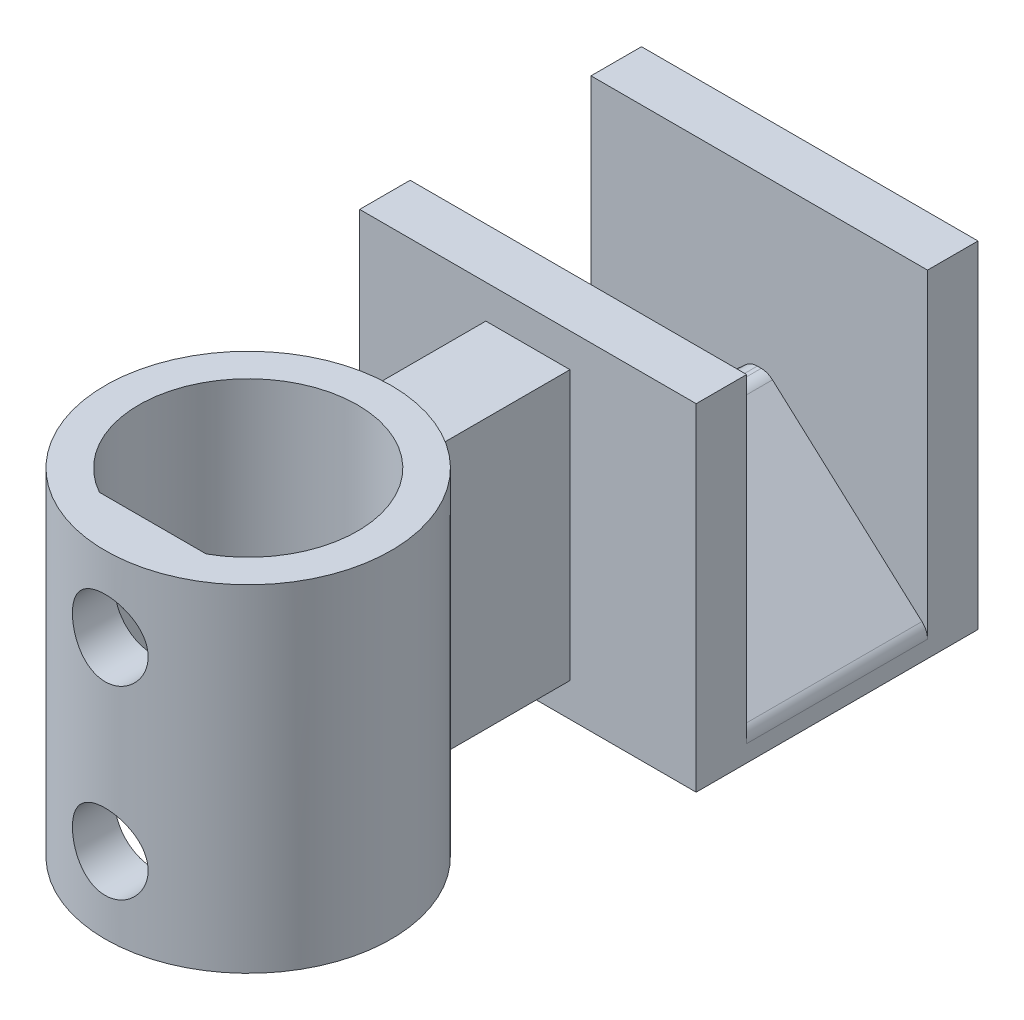
ISO-10303-21;
HEADER;
FILE_DESCRIPTION(('STEP AP214'),'2;1');
FILE_NAME('part.step','',(''),(''),'','','');
FILE_SCHEMA(('AUTOMOTIVE_DESIGN { 1 0 10303 214 1 1 1 1 }'));
ENDSEC;
DATA;
#1=APPLICATION_CONTEXT('core data for automotive mechanical design processes');
#2=APPLICATION_PROTOCOL_DEFINITION('international standard','automotive_design',2000,#1);
#3=PRODUCT_CONTEXT('',#1,'mechanical');
#4=PRODUCT('Part','Part','',(#3));
#5=PRODUCT_RELATED_PRODUCT_CATEGORY('part','',(#4));
#6=PRODUCT_DEFINITION_FORMATION('','',#4);
#7=PRODUCT_DEFINITION_CONTEXT('part definition',#1,'design');
#8=PRODUCT_DEFINITION('design','',#6,#7);
#9=PRODUCT_DEFINITION_SHAPE('','',#8);
#10=(LENGTH_UNIT() NAMED_UNIT(*) SI_UNIT(.MILLI.,.METRE.));
#11=(NAMED_UNIT(*) PLANE_ANGLE_UNIT() SI_UNIT($,.RADIAN.));
#12=(NAMED_UNIT(*) SI_UNIT($,.STERADIAN.) SOLID_ANGLE_UNIT());
#13=UNCERTAINTY_MEASURE_WITH_UNIT(LENGTH_MEASURE(1.E-05),#10,'distance_accuracy_value','');
#14=(GEOMETRIC_REPRESENTATION_CONTEXT(3) GLOBAL_UNCERTAINTY_ASSIGNED_CONTEXT((#13)) GLOBAL_UNIT_ASSIGNED_CONTEXT((#10,
#11,#12)) REPRESENTATION_CONTEXT('',''));
#15=CARTESIAN_POINT('',(0.,0.,0.));
#16=DIRECTION('',(0.,0.,1.));
#17=DIRECTION('',(1.,0.,0.));
#18=AXIS2_PLACEMENT_3D('',#15,#16,#17);
#19=CARTESIAN_POINT('',(0.,39.0416305603426,25.));
#20=DIRECTION('',(0.,-1.,0.));
#21=DIRECTION('',(0.,0.,-1.));
#22=AXIS2_PLACEMENT_3D('',#19,#20,#21);
#23=CYLINDRICAL_SURFACE('',#22,8.5);
#24=CARTESIAN_POINT('',(0.,15.,25.));
#25=DIRECTION('',(0.,-1.,0.));
#26=DIRECTION('',(0.,0.,-1.));
#27=AXIS2_PLACEMENT_3D('',#24,#25,#26);
#28=CIRCLE('',#27,8.5);
#29=CARTESIAN_POINT('',(0.,15.,16.5));
#30=VERTEX_POINT('',#29);
#31=EDGE_CURVE('E186',#30,#30,#28,.T.);
#32=ORIENTED_EDGE('',*,*,#31,.T.);
#33=EDGE_LOOP('',(#32));
#34=FACE_BOUND('',#33,.T.);
#35=CARTESIAN_POINT('',(0.,-5.,25.));
#36=DIRECTION('',(0.,1.,0.));
#37=DIRECTION('',(0.,0.,1.));
#38=AXIS2_PLACEMENT_3D('',#35,#36,#37);
#39=CIRCLE('',#38,8.5);
#40=CARTESIAN_POINT('',(0.,-5.,33.5));
#41=VERTEX_POINT('',#40);
#42=EDGE_CURVE('E192',#41,#41,#39,.F.);
#43=ORIENTED_EDGE('',*,*,#42,.F.);
#44=EDGE_LOOP('',(#43));
#45=FACE_BOUND('',#44,.T.);
#46=CARTESIAN_POINT('',(0.,-3.,25.));
#47=DIRECTION('',(0.,1.,0.));
#48=DIRECTION('',(0.,0.,1.));
#49=AXIS2_PLACEMENT_3D('',#46,#47,#48);
#50=CIRCLE('',#49,8.5);
#51=CARTESIAN_POINT('',(-2.5,-3.,16.875961595364));
#52=VERTEX_POINT('',#51);
#53=CARTESIAN_POINT('',(2.5,-3.,16.875961595364));
#54=VERTEX_POINT('',#53);
#55=EDGE_CURVE('E226',#52,#54,#50,.F.);
#56=ORIENTED_EDGE('',*,*,#55,.T.);
#57=DIRECTION('',(0.,-1.,0.));
#58=VECTOR('',#57,1.);
#59=CARTESIAN_POINT('',(2.5,39.0416305603426,16.875961595364));
#60=LINE('',#59,#58);
#61=CARTESIAN_POINT('',(2.5,13.,16.875961595364));
#62=VERTEX_POINT('',#61);
#63=EDGE_CURVE('E211',#54,#62,#60,.F.);
#64=ORIENTED_EDGE('',*,*,#63,.T.);
#65=CARTESIAN_POINT('',(0.,13.,25.));
#66=DIRECTION('',(0.,-1.,0.));
#67=DIRECTION('',(0.,0.,-1.));
#68=AXIS2_PLACEMENT_3D('',#65,#66,#67);
#69=CIRCLE('',#68,8.5);
#70=CARTESIAN_POINT('',(-2.5,13.,16.875961595364));
#71=VERTEX_POINT('',#70);
#72=EDGE_CURVE('E233',#62,#71,#69,.F.);
#73=ORIENTED_EDGE('',*,*,#72,.T.);
#74=DIRECTION('',(0.,-1.,0.));
#75=VECTOR('',#74,1.);
#76=CARTESIAN_POINT('',(-2.5,39.0416305603426,16.875961595364));
#77=LINE('',#76,#75);
#78=EDGE_CURVE('E230',#71,#52,#77,.T.);
#79=ORIENTED_EDGE('',*,*,#78,.T.);
#80=EDGE_LOOP('',(#56,#64,#73,#79));
#81=FACE_BOUND('',#80,.T.);
#82=CARTESIAN_POINT('',(-2.25,10.5,33.1967981553775));
#83=CARTESIAN_POINT('',(-2.24999694180408,10.6239840002776,33.1968003362435));
#84=CARTESIAN_POINT('',(-2.23971706610501,10.7480005412109,33.1996419584915));
#85=CARTESIAN_POINT('',(-2.198945615888,10.9924544608563,33.2106680196964));
#86=CARTESIAN_POINT('',(-2.16844370713168,11.112889976629,33.2188551904021));
#87=CARTESIAN_POINT('',(-2.0882990785985,11.3466102401079,33.2395815791112));
#88=CARTESIAN_POINT('',(-2.03868300476042,11.459904688051,33.2521147362105));
#89=CARTESIAN_POINT('',(-1.92180166354043,11.6765786826062,33.2801132198881));
#90=CARTESIAN_POINT('',(-1.85453509902009,11.7799574997535,33.2955787619447));
#91=CARTESIAN_POINT('',(-1.70248951742595,11.9764139017784,33.3281265446091));
#92=CARTESIAN_POINT('',(-1.61735395744878,12.0692109081865,33.3452371126252));
#93=CARTESIAN_POINT('',(-1.4327540142738,12.2393902103004,33.3789023677977));
#94=CARTESIAN_POINT('',(-1.33328816547564,12.3167709274061,33.3954569978831));
#95=CARTESIAN_POINT('',(-1.12090838569079,12.4550884366435,33.4264608929721));
#96=CARTESIAN_POINT('',(-1.00780712819347,12.5157466883929,33.4408728427373));
#97=CARTESIAN_POINT('',(-0.772566710508234,12.6170815196129,33.4656427357432));
#98=CARTESIAN_POINT('',(-0.650429055025734,12.6577614172222,33.4760013521304));
#99=CARTESIAN_POINT('',(-0.403511110172187,12.7170778425828,33.4912971460741));
#100=CARTESIAN_POINT('',(-0.278852839843893,12.7361915561904,33.4963515042717));
#101=CARTESIAN_POINT('',(-0.0280034780646866,12.7533339423421,33.5008788349257));
#102=CARTESIAN_POINT('',(0.0981873570184365,12.7513660941808,33.5003527283806));
#103=CARTESIAN_POINT('',(0.34519977639906,12.7267381177659,33.4938644304373));
#104=CARTESIAN_POINT('',(0.466076857336715,12.7045934898765,33.4880376721779));
#105=CARTESIAN_POINT('',(0.702334013138001,12.6410728615727,33.4717623278363));
#106=CARTESIAN_POINT('',(0.817713776487286,12.5996957727456,33.4613134801802));
#107=CARTESIAN_POINT('',(1.04102215095086,12.4984870248307,33.4367663576623));
#108=CARTESIAN_POINT('',(1.14886634833951,12.4384779194592,33.4226332115479));
#109=CARTESIAN_POINT('',(1.3531303740591,12.301844580475,33.3922415251126));
#110=CARTESIAN_POINT('',(1.44954799839656,12.2252171495074,33.375982576028));
#111=CARTESIAN_POINT('',(1.63129857081783,12.0547825542084,33.342521924539));
#112=CARTESIAN_POINT('',(1.71620777876131,11.9605256731685,33.3253065822884));
#113=CARTESIAN_POINT('',(1.86911637013184,11.7589321307718,33.2923181202052));
#114=CARTESIAN_POINT('',(1.93711475347608,11.6515946964081,33.2765450857034));
#115=CARTESIAN_POINT('',(2.05458778503724,11.4259787352489,33.2481731019722));
#116=CARTESIAN_POINT('',(2.10394886477225,11.3076384369629,33.2355937612802));
#117=CARTESIAN_POINT('',(2.18193716023719,11.0639230764637,33.2152779792318));
#118=CARTESIAN_POINT('',(2.21056943128527,10.9385497375025,33.207540357145));
#119=CARTESIAN_POINT('',(2.24556016825425,10.6882860893502,33.1980351929453));
#120=CARTESIAN_POINT('',(2.25255005779307,10.5634903897575,33.1960984643835));
#121=CARTESIAN_POINT('',(2.24579596911986,10.3145136151024,33.1979517680045));
#122=CARTESIAN_POINT('',(2.23205416085442,10.19033247708,33.2017412008412));
#123=CARTESIAN_POINT('',(2.18478304951454,9.94853203437677,33.2144565867633));
#124=CARTESIAN_POINT('',(2.15163187005439,9.83083314067768,33.2232843058655));
#125=CARTESIAN_POINT('',(2.06690749717098,9.60266578735862,33.2449859622244));
#126=CARTESIAN_POINT('',(2.0153319242454,9.49219826384843,33.2578604220901));
#127=CARTESIAN_POINT('',(1.89393612864426,9.27898360406455,33.2865532711528));
#128=CARTESIAN_POINT('',(1.82374430356199,9.17645600255329,33.3024294781708));
#129=CARTESIAN_POINT('',(1.66757023068808,8.98440278488017,33.3352002454647));
#130=CARTESIAN_POINT('',(1.58158505971235,8.89487958119961,33.3520949938724));
#131=CARTESIAN_POINT('',(1.39334723217788,8.72876291555247,33.3855805923336));
#132=CARTESIAN_POINT('',(1.29070161878611,8.65260935870141,33.4021491503459));
#133=CARTESIAN_POINT('',(1.07371678547403,8.51861464758931,33.4326221761272));
#134=CARTESIAN_POINT('',(0.959378187911347,8.46077251937521,33.4465267855714));
#135=CARTESIAN_POINT('',(0.723057226149525,8.36557056201773,33.470015772103));
#136=CARTESIAN_POINT('',(0.60113959611423,8.32805833034544,33.4796321961789));
#137=CARTESIAN_POINT('',(0.352439036803731,8.2741367860407,33.4936022569498));
#138=CARTESIAN_POINT('',(0.225657174963255,8.25772287044393,33.4979570415506));
#139=CARTESIAN_POINT('',(-0.0250604722587875,8.24674873433714,33.5008598374346));
#140=CARTESIAN_POINT('',(-0.148966409472797,8.2515427679478,33.499579436696));
#141=CARTESIAN_POINT('',(-0.394141954180563,8.28135153536109,33.4917428575153));
#142=CARTESIAN_POINT('',(-0.515411657917084,8.30636552970252,33.4851868720061));
#143=CARTESIAN_POINT('',(-0.751107699159933,8.37554121781611,33.4675689262979));
#144=CARTESIAN_POINT('',(-0.865574416324465,8.41957360028427,33.4565374265752));
#145=CARTESIAN_POINT('',(-1.08556048681217,8.5254205314973,33.4311229382255));
#146=CARTESIAN_POINT('',(-1.19107859706731,8.58723754551755,33.4167394850088));
#147=CARTESIAN_POINT('',(-1.39318530515942,8.72879850578497,33.3856885458129));
#148=CARTESIAN_POINT('',(-1.48946543719377,8.80897181418192,33.3689708718519));
#149=CARTESIAN_POINT('',(-1.66742398064291,8.98415288335479,33.3353414220771));
#150=CARTESIAN_POINT('',(-1.74909856114583,9.07916452389294,33.3184295965731));
#151=CARTESIAN_POINT('',(-1.8972708258445,9.2837921479421,33.285906991571));
#152=CARTESIAN_POINT('',(-1.96340296292341,9.39367904330234,33.2703321637851));
#153=CARTESIAN_POINT('',(-2.07615948784757,9.62341015894324,33.2427515934587));
#154=CARTESIAN_POINT('',(-2.12279681152532,9.74324771294936,33.2307434857482));
#155=CARTESIAN_POINT('',(-2.18903256232817,9.96889360228065,33.2133487458215));
#156=CARTESIAN_POINT('',(-2.21184214669942,10.0737109686333,33.2071920574266));
#157=CARTESIAN_POINT('',(-2.24232635318084,10.2856776239988,33.1989160421293));
#158=CARTESIAN_POINT('',(-2.25000264354342,10.3928266546586,33.1967962702092));
#159=CARTESIAN_POINT('',(-2.25,10.5,33.1967981553775));
#160=B_SPLINE_CURVE_WITH_KNOTS('',3,(#82,#83,#84,#85,#86,#87,#88,#89,#90,#91,#92,#93,#94,#95,
#96,#97,#98,#99,#100,#101,#102,#103,#104,#105,#106,#107,#108,#109,#110,#111,#112,#113,#114,#115,
#116,#117,#118,#119,#120,#121,#122,#123,#124,#125,#126,#127,#128,#129,#130,#131,#132,#133,#134,
#135,#136,#137,#138,#139,#140,#141,#142,#143,#144,#145,#146,#147,#148,#149,#150,#151,#152,#153,
#154,#155,#156,#157,#158,#159),.UNSPECIFIED.,.T.,.F.,(4,2,2,2,2,2,2,2,2,2,2,2,2,2,2,2,2,2,2,2,2,
2,2,2,2,2,2,2,2,2,2,2,2,2,2,2,2,2,4),(0.,0.37155797163531,0.743305970231715,1.11453760110695,
1.48579652152091,1.86532086241599,2.24488404596034,2.63043245150024,3.01591680090743,
3.39269333716487,3.76940769129443,4.13675920765004,4.50413151587257,4.87511584526133,
5.24617161521628,5.62845622010334,6.01076342740043,6.3953640456007,6.77987083621654,
7.15304843134813,7.52618696941451,7.89228731518204,8.25843495975225,8.63252754907452,
9.00668944894658,9.39148781847044,9.77626571779774,10.1581177737158,10.539886507824,
10.9101123860205,11.2803247253535,11.6480585642679,12.0158434024024,12.3933170752266,
12.7708896114263,13.156610044578,13.5420741241071,13.8632889681006,14.1844684002793),.UNSPECIFIED.);
#161=CARTESIAN_POINT('',(-2.25,10.5,33.1967981553775));
#162=VERTEX_POINT('',#161);
#163=EDGE_CURVE('E198',#162,#162,#160,.T.);
#164=ORIENTED_EDGE('',*,*,#163,.T.);
#165=EDGE_LOOP('',(#164));
#166=FACE_BOUND('',#165,.T.);
#167=CARTESIAN_POINT('',(-2.25,-0.500000000000002,33.1967981553775));
#168=CARTESIAN_POINT('',(-2.24999694180408,-0.376015999722374,33.1968003362435));
#169=CARTESIAN_POINT('',(-2.23971706610501,-0.251999458789078,33.1996419584915));
#170=CARTESIAN_POINT('',(-2.198945615888,-0.00754553914369019,33.2106680196964));
#171=CARTESIAN_POINT('',(-2.16844370713168,0.112889976628972,33.2188551904021));
#172=CARTESIAN_POINT('',(-2.0882990785985,0.346610240107896,33.2395815791112));
#173=CARTESIAN_POINT('',(-2.03868300476042,0.459904688051024,33.2521147362105));
#174=CARTESIAN_POINT('',(-1.92180166354043,0.676578682606188,33.2801132198881));
#175=CARTESIAN_POINT('',(-1.85453509902009,0.779957499753548,33.2955787619447));
#176=CARTESIAN_POINT('',(-1.70248951742595,0.976413901778359,33.3281265446091));
#177=CARTESIAN_POINT('',(-1.61735395744878,1.06921090818649,33.3452371126252));
#178=CARTESIAN_POINT('',(-1.4327540142738,1.23939021030035,33.3789023677977));
#179=CARTESIAN_POINT('',(-1.33328816547564,1.31677092740614,33.3954569978831));
#180=CARTESIAN_POINT('',(-1.12090838569079,1.45508843664353,33.426460892972));
#181=CARTESIAN_POINT('',(-1.00780712819347,1.51574668839292,33.4408728427372));
#182=CARTESIAN_POINT('',(-0.772566710508234,1.6170815196129,33.4656427357431));
#183=CARTESIAN_POINT('',(-0.650429055025735,1.65776141722221,33.4760013521304));
#184=CARTESIAN_POINT('',(-0.403511110172187,1.71707784258281,33.4912971460741));
#185=CARTESIAN_POINT('',(-0.278852839843893,1.73619155619042,33.4963515042717));
#186=CARTESIAN_POINT('',(-0.0280034780646869,1.75333394234214,33.5008788349257));
#187=CARTESIAN_POINT('',(0.0981873570184361,1.75136609418084,33.5003527283806));
#188=CARTESIAN_POINT('',(0.34519977639906,1.72673811776592,33.4938644304373));
#189=CARTESIAN_POINT('',(0.466076857336715,1.70459348987647,33.4880376721779));
#190=CARTESIAN_POINT('',(0.702334013138001,1.6410728615727,33.4717623278363));
#191=CARTESIAN_POINT('',(0.817713776487285,1.59969577274563,33.4613134801802));
#192=CARTESIAN_POINT('',(1.04102215095086,1.49848702483075,33.4367663576623));
#193=CARTESIAN_POINT('',(1.14886634833951,1.43847791945919,33.4226332115479));
#194=CARTESIAN_POINT('',(1.3531303740591,1.30184458047502,33.3922415251126));
#195=CARTESIAN_POINT('',(1.44954799839656,1.22521714950741,33.375982576028));
#196=CARTESIAN_POINT('',(1.63129857081783,1.05478255420836,33.342521924539));
#197=CARTESIAN_POINT('',(1.71620777876131,0.960525673168511,33.3253065822884));
#198=CARTESIAN_POINT('',(1.86911637013183,0.758932130771777,33.2923181202052));
#199=CARTESIAN_POINT('',(1.93711475347608,0.651594696408099,33.2765450857034));
#200=CARTESIAN_POINT('',(2.05458778503724,0.425978735248875,33.2481731019722));
#201=CARTESIAN_POINT('',(2.10394886477225,0.307638436962872,33.2355937612802));
#202=CARTESIAN_POINT('',(2.18193716023719,0.0639230764637289,33.2152779792318));
#203=CARTESIAN_POINT('',(2.21056943128527,-0.0614502624975041,33.207540357145));
#204=CARTESIAN_POINT('',(2.24556016825425,-0.311713910649751,33.1980351929453));
#205=CARTESIAN_POINT('',(2.25255005779307,-0.436509610242537,33.1960984643835));
#206=CARTESIAN_POINT('',(2.24579596911986,-0.685486384897617,33.1979517680045));
#207=CARTESIAN_POINT('',(2.23205416085442,-0.809667522920008,33.2017412008412));
#208=CARTESIAN_POINT('',(2.18478304951454,-1.05146796562323,33.2144565867633));
#209=CARTESIAN_POINT('',(2.15163187005439,-1.16916685932232,33.2232843058654));
#210=CARTESIAN_POINT('',(2.06690749717098,-1.39733421264138,33.2449859622244));
#211=CARTESIAN_POINT('',(2.0153319242454,-1.50780173615157,33.2578604220901));
#212=CARTESIAN_POINT('',(1.89393612864426,-1.72101639593545,33.2865532711528));
#213=CARTESIAN_POINT('',(1.82374430356199,-1.82354399744671,33.3024294781708));
#214=CARTESIAN_POINT('',(1.66757023068808,-2.01559721511983,33.3352002454647));
#215=CARTESIAN_POINT('',(1.58158505971235,-2.10512041880039,33.3520949938724));
#216=CARTESIAN_POINT('',(1.39334723217788,-2.27123708444753,33.3855805923336));
#217=CARTESIAN_POINT('',(1.29070161878611,-2.34739064129859,33.4021491503459));
#218=CARTESIAN_POINT('',(1.07371678547403,-2.48138535241069,33.4326221761272));
#219=CARTESIAN_POINT('',(0.959378187911347,-2.53922748062479,33.4465267855714));
#220=CARTESIAN_POINT('',(0.723057226149525,-2.63442943798227,33.470015772103));
#221=CARTESIAN_POINT('',(0.60113959611423,-2.67194166965456,33.4796321961789));
#222=CARTESIAN_POINT('',(0.352439036803731,-2.7258632139593,33.4936022569498));
#223=CARTESIAN_POINT('',(0.225657174963256,-2.74227712955607,33.4979570415506));
#224=CARTESIAN_POINT('',(-0.0250604722587871,-2.75325126566286,33.5008598374346));
#225=CARTESIAN_POINT('',(-0.148966409472797,-2.7484572320522,33.499579436696));
#226=CARTESIAN_POINT('',(-0.394141954180563,-2.71864846463891,33.4917428575153));
#227=CARTESIAN_POINT('',(-0.515411657917083,-2.69363447029748,33.4851868720061));
#228=CARTESIAN_POINT('',(-0.751107699159933,-2.62445878218389,33.4675689262979));
#229=CARTESIAN_POINT('',(-0.865574416324465,-2.58042639971573,33.4565374265752));
#230=CARTESIAN_POINT('',(-1.08556048681217,-2.4745794685027,33.4311229382255));
#231=CARTESIAN_POINT('',(-1.19107859706731,-2.41276245448245,33.4167394850088));
#232=CARTESIAN_POINT('',(-1.39318530515942,-2.27120149421503,33.3856885458129));
#233=CARTESIAN_POINT('',(-1.48946543719377,-2.19102818581808,33.3689708718519));
#234=CARTESIAN_POINT('',(-1.66742398064291,-2.01584711664521,33.3353414220771));
#235=CARTESIAN_POINT('',(-1.74909856114582,-1.92083547610706,33.3184295965731));
#236=CARTESIAN_POINT('',(-1.8972708258445,-1.7162078520579,33.285906991571));
#237=CARTESIAN_POINT('',(-1.96340296292341,-1.60632095669767,33.2703321637851));
#238=CARTESIAN_POINT('',(-2.07615948784757,-1.37658984105676,33.2427515934587));
#239=CARTESIAN_POINT('',(-2.12279681152532,-1.25675228705065,33.2307434857482));
#240=CARTESIAN_POINT('',(-2.18903256232817,-1.03110639771935,33.2133487458215));
#241=CARTESIAN_POINT('',(-2.21184214669942,-0.92628903136672,33.2071920574266));
#242=CARTESIAN_POINT('',(-2.24232635318084,-0.714322376001232,33.1989160421293));
#243=CARTESIAN_POINT('',(-2.25000264354342,-0.607173345341352,33.1967962702092));
#244=CARTESIAN_POINT('',(-2.25,-0.500000000000002,33.1967981553775));
#245=B_SPLINE_CURVE_WITH_KNOTS('',3,(#167,#168,#169,#170,#171,#172,#173,#174,#175,#176,#177,
#178,#179,#180,#181,#182,#183,#184,#185,#186,#187,#188,#189,#190,#191,#192,#193,#194,#195,#196,
#197,#198,#199,#200,#201,#202,#203,#204,#205,#206,#207,#208,#209,#210,#211,#212,#213,#214,#215,
#216,#217,#218,#219,#220,#221,#222,#223,#224,#225,#226,#227,#228,#229,#230,#231,#232,#233,#234,
#235,#236,#237,#238,#239,#240,#241,#242,#243,#244),.UNSPECIFIED.,.T.,.F.,(4,2,2,2,2,2,2,2,2,2,2,
2,2,2,2,2,2,2,2,2,2,2,2,2,2,2,2,2,2,2,2,2,2,2,2,2,2,2,4),(0.,0.371557971635309,
0.743305970231715,1.11453760110695,1.48579652152091,1.86532086241599,2.24488404596033,
2.63043245150024,3.01591680090743,3.39269333716487,3.76940769129443,4.13675920765004,
4.50413151587256,4.87511584526133,5.24617161521628,5.62845622010334,6.01076342740043,
6.3953640456007,6.77987083621654,7.15304843134812,7.5261869694145,7.89228731518204,
8.25843495975225,8.63252754907452,9.00668944894658,9.39148781847044,9.77626571779773,
10.1581177737158,10.539886507824,10.9101123860205,11.2803247253535,11.6480585642679,
12.0158434024024,12.3933170752266,12.7708896114263,13.156610044578,13.5420741241071,
13.8632889681006,14.1844684002793),.UNSPECIFIED.);
#246=CARTESIAN_POINT('',(-2.25,-0.500000000000002,33.1967981553775));
#247=VERTEX_POINT('',#246);
#248=EDGE_CURVE('E616',#247,#247,#245,.T.);
#249=ORIENTED_EDGE('',*,*,#248,.T.);
#250=EDGE_LOOP('',(#249));
#251=FACE_BOUND('',#250,.T.);
#252=ADVANCED_FACE('F35',(#34,#45,#81,#166,#251),#23,.T.);
#253=CARTESIAN_POINT('',(0.,0.,8.375));
#254=DIRECTION('',(0.,0.,1.));
#255=DIRECTION('',(1.,0.,0.));
#256=AXIS2_PLACEMENT_3D('',#253,#254,#255);
#257=PLANE('',#256);
#258=DIRECTION('',(0.,1.,0.));
#259=VECTOR('',#258,1.);
#260=CARTESIAN_POINT('',(10.,15.,8.375));
#261=LINE('',#260,#259);
#262=CARTESIAN_POINT('',(10.,-5.,8.375));
#263=VERTEX_POINT('',#262);
#264=CARTESIAN_POINT('',(10.,15.,8.375));
#265=VERTEX_POINT('',#264);
#266=EDGE_CURVE('E263',#263,#265,#261,.T.);
#267=ORIENTED_EDGE('',*,*,#266,.T.);
#268=DIRECTION('',(-1.,0.,0.));
#269=VECTOR('',#268,1.);
#270=CARTESIAN_POINT('',(-10.,15.,8.375));
#271=LINE('',#270,#269);
#272=CARTESIAN_POINT('',(-10.,15.,8.375));
#273=VERTEX_POINT('',#272);
#274=EDGE_CURVE('E266',#265,#273,#271,.T.);
#275=ORIENTED_EDGE('',*,*,#274,.T.);
#276=DIRECTION('',(0.,-1.,0.));
#277=VECTOR('',#276,1.);
#278=CARTESIAN_POINT('',(-10.,15.,8.375));
#279=LINE('',#278,#277);
#280=CARTESIAN_POINT('',(-10.,-5.,8.375));
#281=VERTEX_POINT('',#280);
#282=EDGE_CURVE('E269',#273,#281,#279,.T.);
#283=ORIENTED_EDGE('',*,*,#282,.T.);
#284=DIRECTION('',(1.,0.,0.));
#285=VECTOR('',#284,1.);
#286=CARTESIAN_POINT('',(-10.,-5.,8.375));
#287=LINE('',#286,#285);
#288=EDGE_CURVE('E272',#281,#263,#287,.T.);
#289=ORIENTED_EDGE('',*,*,#288,.T.);
#290=EDGE_LOOP('',(#267,#275,#283,#289));
#291=FACE_BOUND('',#290,.T.);
#292=DIRECTION('',(-1.,0.,0.));
#293=VECTOR('',#292,1.);
#294=CARTESIAN_POINT('',(-2.5,13.,8.375));
#295=LINE('',#294,#293);
#296=CARTESIAN_POINT('',(2.5,13.,8.375));
#297=VERTEX_POINT('',#296);
#298=CARTESIAN_POINT('',(-2.5,13.,8.375));
#299=VERTEX_POINT('',#298);
#300=EDGE_CURVE('E215',#297,#299,#295,.T.);
#301=ORIENTED_EDGE('',*,*,#300,.F.);
#302=DIRECTION('',(0.,1.,0.));
#303=VECTOR('',#302,1.);
#304=CARTESIAN_POINT('',(2.5,13.,8.375));
#305=LINE('',#304,#303);
#306=CARTESIAN_POINT('',(2.5,-3.,8.375));
#307=VERTEX_POINT('',#306);
#308=EDGE_CURVE('E219',#307,#297,#305,.T.);
#309=ORIENTED_EDGE('',*,*,#308,.F.);
#310=DIRECTION('',(1.,0.,0.));
#311=VECTOR('',#310,1.);
#312=CARTESIAN_POINT('',(-2.5,-3.,8.375));
#313=LINE('',#312,#311);
#314=CARTESIAN_POINT('',(-2.5,-3.,8.375));
#315=VERTEX_POINT('',#314);
#316=EDGE_CURVE('E208',#315,#307,#313,.T.);
#317=ORIENTED_EDGE('',*,*,#316,.F.);
#318=DIRECTION('',(0.,-1.,0.));
#319=VECTOR('',#318,1.);
#320=CARTESIAN_POINT('',(-2.5,13.,8.375));
#321=LINE('',#320,#319);
#322=EDGE_CURVE('E52',#299,#315,#321,.T.);
#323=ORIENTED_EDGE('',*,*,#322,.F.);
#324=EDGE_LOOP('',(#301,#309,#317,#323));
#325=FACE_BOUND('',#324,.T.);
#326=ADVANCED_FACE('F396',(#291,#325),#257,.T.);
#327=CARTESIAN_POINT('',(10.,-5.,5.375));
#328=DIRECTION('',(-1.,0.,0.));
#329=DIRECTION('',(0.,0.,1.));
#330=AXIS2_PLACEMENT_3D('',#327,#328,#329);
#331=PLANE('',#330);
#332=DIRECTION('',(0.,0.,-1.));
#333=VECTOR('',#332,1.);
#334=CARTESIAN_POINT('',(10.,-5.,5.375));
#335=LINE('',#334,#333);
#336=CARTESIAN_POINT('',(10.,-5.,-8.375));
#337=VERTEX_POINT('',#336);
#338=EDGE_CURVE('E290',#263,#337,#335,.T.);
#339=ORIENTED_EDGE('',*,*,#338,.T.);
#340=DIRECTION('',(0.,1.,0.));
#341=VECTOR('',#340,1.);
#342=CARTESIAN_POINT('',(10.,15.,-8.375));
#343=LINE('',#342,#341);
#344=CARTESIAN_POINT('',(10.,15.,-8.375));
#345=VERTEX_POINT('',#344);
#346=EDGE_CURVE('E238',#337,#345,#343,.T.);
#347=ORIENTED_EDGE('',*,*,#346,.T.);
#348=DIRECTION('',(0.,0.,1.));
#349=VECTOR('',#348,1.);
#350=CARTESIAN_POINT('',(10.,15.,-8.375));
#351=LINE('',#350,#349);
#352=CARTESIAN_POINT('',(10.,15.,-5.375));
#353=VERTEX_POINT('',#352);
#354=EDGE_CURVE('E251',#345,#353,#351,.T.);
#355=ORIENTED_EDGE('',*,*,#354,.T.);
#356=DIRECTION('',(0.,1.,0.));
#357=VECTOR('',#356,1.);
#358=CARTESIAN_POINT('',(10.,15.,-5.375));
#359=LINE('',#358,#357);
#360=CARTESIAN_POINT('',(10.,-3.99906710613801,-5.375));
#361=VERTEX_POINT('',#360);
#362=EDGE_CURVE('E229',#361,#353,#359,.T.);
#363=ORIENTED_EDGE('',*,*,#362,.F.);
#364=DIRECTION('',(0.,0.,-1.));
#365=VECTOR('',#364,1.);
#366=CARTESIAN_POINT('',(10.,-3.99906710613801,5.375));
#367=LINE('',#366,#365);
#368=CARTESIAN_POINT('',(10.,-3.99906710613801,5.375));
#369=VERTEX_POINT('',#368);
#370=EDGE_CURVE('E336',#361,#369,#367,.F.);
#371=ORIENTED_EDGE('',*,*,#370,.T.);
#372=DIRECTION('',(0.,1.,0.));
#373=VECTOR('',#372,1.);
#374=CARTESIAN_POINT('',(10.,15.,5.375));
#375=LINE('',#374,#373);
#376=CARTESIAN_POINT('',(10.,15.,5.375));
#377=VERTEX_POINT('',#376);
#378=EDGE_CURVE('E262',#369,#377,#375,.T.);
#379=ORIENTED_EDGE('',*,*,#378,.T.);
#380=DIRECTION('',(0.,0.,-1.));
#381=VECTOR('',#380,1.);
#382=CARTESIAN_POINT('',(10.,15.,8.375));
#383=LINE('',#382,#381);
#384=EDGE_CURVE('E283',#265,#377,#383,.T.);
#385=ORIENTED_EDGE('',*,*,#384,.F.);
#386=ORIENTED_EDGE('',*,*,#266,.F.);
#387=EDGE_LOOP('',(#339,#347,#355,#363,#371,#379,#385,#386));
#388=FACE_BOUND('',#387,.T.);
#389=ADVANCED_FACE('F374',(#388),#331,.F.);
#390=CARTESIAN_POINT('',(-10.,5.,5.375));
#391=DIRECTION('',(0.,-1.,0.));
#392=DIRECTION('',(0.,0.,-1.));
#393=AXIS2_PLACEMENT_3D('',#390,#391,#392);
#394=PLANE('',#393);
#395=DIRECTION('',(-1.,0.,0.));
#396=VECTOR('',#395,1.);
#397=CARTESIAN_POINT('',(-10.,5.,5.375));
#398=LINE('',#397,#396);
#399=CARTESIAN_POINT('',(0.116135964964558,5.,5.375));
#400=VERTEX_POINT('',#399);
#401=CARTESIAN_POINT('',(-0.116135964964551,5.,5.375));
#402=VERTEX_POINT('',#401);
#403=EDGE_CURVE('E287',#400,#402,#398,.T.);
#404=ORIENTED_EDGE('',*,*,#403,.F.);
#405=DIRECTION('',(0.,0.,1.));
#406=VECTOR('',#405,1.);
#407=CARTESIAN_POINT('',(0.116135964964558,5.,-5.375));
#408=LINE('',#407,#406);
#409=CARTESIAN_POINT('',(0.116135964964558,5.,-5.375));
#410=VERTEX_POINT('',#409);
#411=EDGE_CURVE('E11',#400,#410,#408,.F.);
#412=ORIENTED_EDGE('',*,*,#411,.T.);
#413=DIRECTION('',(-1.,0.,0.));
#414=VECTOR('',#413,1.);
#415=CARTESIAN_POINT('',(-10.,5.,-5.375));
#416=LINE('',#415,#414);
#417=CARTESIAN_POINT('',(-0.116135964964551,5.,-5.375));
#418=VERTEX_POINT('',#417);
#419=EDGE_CURVE('E286',#410,#418,#416,.T.);
#420=ORIENTED_EDGE('',*,*,#419,.T.);
#421=DIRECTION('',(0.,0.,-1.));
#422=VECTOR('',#421,1.);
#423=CARTESIAN_POINT('',(-0.116135964964551,5.,5.375));
#424=LINE('',#423,#422);
#425=EDGE_CURVE('E44',#418,#402,#424,.F.);
#426=ORIENTED_EDGE('',*,*,#425,.T.);
#427=EDGE_LOOP('',(#404,#412,#420,#426));
#428=FACE_BOUND('',#427,.T.);
#429=ADVANCED_FACE('F344',(#428),#394,.F.);
#430=CARTESIAN_POINT('',(-10.,-5.,5.375));
#431=DIRECTION('',(1.,0.,0.));
#432=DIRECTION('',(0.,0.,-1.));
#433=AXIS2_PLACEMENT_3D('',#430,#431,#432);
#434=PLANE('',#433);
#435=DIRECTION('',(0.,0.,-1.));
#436=VECTOR('',#435,1.);
#437=CARTESIAN_POINT('',(-10.,-5.,5.375));
#438=LINE('',#437,#436);
#439=CARTESIAN_POINT('',(-10.,-5.,-8.375));
#440=VERTEX_POINT('',#439);
#441=EDGE_CURVE('E293',#281,#440,#438,.T.);
#442=ORIENTED_EDGE('',*,*,#441,.F.);
#443=ORIENTED_EDGE('',*,*,#282,.F.);
#444=DIRECTION('',(0.,0.,-1.));
#445=VECTOR('',#444,1.);
#446=CARTESIAN_POINT('',(-10.,15.,8.375));
#447=LINE('',#446,#445);
#448=CARTESIAN_POINT('',(-10.,15.,5.375));
#449=VERTEX_POINT('',#448);
#450=EDGE_CURVE('E275',#273,#449,#447,.T.);
#451=ORIENTED_EDGE('',*,*,#450,.T.);
#452=DIRECTION('',(0.,-1.,0.));
#453=VECTOR('',#452,1.);
#454=CARTESIAN_POINT('',(-10.,15.,5.375));
#455=LINE('',#454,#453);
#456=CARTESIAN_POINT('',(-10.,-3.99906710613801,5.375));
#457=VERTEX_POINT('',#456);
#458=EDGE_CURVE('E267',#449,#457,#455,.T.);
#459=ORIENTED_EDGE('',*,*,#458,.T.);
#460=DIRECTION('',(0.,0.,1.));
#461=VECTOR('',#460,1.);
#462=CARTESIAN_POINT('',(-10.,-3.99906710613801,-5.375));
#463=LINE('',#462,#461);
#464=CARTESIAN_POINT('',(-10.,-3.99906710613801,-5.375));
#465=VERTEX_POINT('',#464);
#466=EDGE_CURVE('E307',#457,#465,#463,.F.);
#467=ORIENTED_EDGE('',*,*,#466,.T.);
#468=DIRECTION('',(0.,-1.,0.));
#469=VECTOR('',#468,1.);
#470=CARTESIAN_POINT('',(-10.,15.,-5.375));
#471=LINE('',#470,#469);
#472=CARTESIAN_POINT('',(-10.,15.,-5.375));
#473=VERTEX_POINT('',#472);
#474=EDGE_CURVE('E253',#473,#465,#471,.T.);
#475=ORIENTED_EDGE('',*,*,#474,.F.);
#476=DIRECTION('',(0.,0.,1.));
#477=VECTOR('',#476,1.);
#478=CARTESIAN_POINT('',(-10.,15.,-8.375));
#479=LINE('',#478,#477);
#480=CARTESIAN_POINT('',(-10.,15.,-8.375));
#481=VERTEX_POINT('',#480);
#482=EDGE_CURVE('E260',#481,#473,#479,.T.);
#483=ORIENTED_EDGE('',*,*,#482,.F.);
#484=DIRECTION('',(0.,-1.,0.));
#485=VECTOR('',#484,1.);
#486=CARTESIAN_POINT('',(-10.,15.,-8.375));
#487=LINE('',#486,#485);
#488=EDGE_CURVE('E245',#481,#440,#487,.T.);
#489=ORIENTED_EDGE('',*,*,#488,.T.);
#490=EDGE_LOOP('',(#442,#443,#451,#459,#467,#475,#483,#489));
#491=FACE_BOUND('',#490,.T.);
#492=ADVANCED_FACE('F365',(#491),#434,.F.);
#493=CARTESIAN_POINT('',(-10.,-5.,5.375));
#494=DIRECTION('',(0.,1.,0.));
#495=DIRECTION('',(0.,0.,1.));
#496=AXIS2_PLACEMENT_3D('',#493,#494,#495);
#497=PLANE('',#496);
#498=ORIENTED_EDGE('',*,*,#441,.T.);
#499=DIRECTION('',(1.,0.,0.));
#500=VECTOR('',#499,1.);
#501=CARTESIAN_POINT('',(-10.,-5.,-8.375));
#502=LINE('',#501,#500);
#503=EDGE_CURVE('E241',#440,#337,#502,.T.);
#504=ORIENTED_EDGE('',*,*,#503,.T.);
#505=ORIENTED_EDGE('',*,*,#338,.F.);
#506=ORIENTED_EDGE('',*,*,#288,.F.);
#507=EDGE_LOOP('',(#498,#504,#505,#506));
#508=FACE_BOUND('',#507,.T.);
#509=ADVANCED_FACE('F384',(#508),#497,.F.);
#510=CARTESIAN_POINT('',(0.499999999999971,5.,5.375));
#511=DIRECTION('',(-0.669130606358857,-0.743144825477395,0.));
#512=DIRECTION('',(0.,0.,-1.));
#513=AXIS2_PLACEMENT_3D('',#510,#511,#512);
#514=PLANE('',#513);
#515=DIRECTION('',(0.743144825477395,-0.669130606358857,0.));
#516=VECTOR('',#515,1.);
#517=CARTESIAN_POINT('',(0.499999999999971,5.,5.375));
#518=LINE('',#517,#516);
#519=CARTESIAN_POINT('',(9.66913060635886,-3.25592228066062,5.375));
#520=VERTEX_POINT('',#519);
#521=CARTESIAN_POINT('',(0.785266571323414,4.7431448254774,5.375));
#522=VERTEX_POINT('',#521);
#523=EDGE_CURVE('E304',#520,#522,#518,.F.);
#524=ORIENTED_EDGE('',*,*,#523,.F.);
#525=DIRECTION('',(0.,0.,1.));
#526=VECTOR('',#525,1.);
#527=CARTESIAN_POINT('',(9.66913060635886,-3.25592228066062,-5.375));
#528=LINE('',#527,#526);
#529=CARTESIAN_POINT('',(9.66913060635886,-3.25592228066062,-5.375));
#530=VERTEX_POINT('',#529);
#531=EDGE_CURVE('E341',#520,#530,#528,.F.);
#532=ORIENTED_EDGE('',*,*,#531,.T.);
#533=DIRECTION('',(-0.743144825477395,0.669130606358857,0.));
#534=VECTOR('',#533,1.);
#535=CARTESIAN_POINT('',(2.71017262260376,3.0099516320112,-5.375));
#536=LINE('',#535,#534);
#537=CARTESIAN_POINT('',(0.785266571323414,4.7431448254774,-5.375));
#538=VERTEX_POINT('',#537);
#539=EDGE_CURVE('E298',#538,#530,#536,.F.);
#540=ORIENTED_EDGE('',*,*,#539,.F.);
#541=DIRECTION('',(0.,0.,-1.));
#542=VECTOR('',#541,1.);
#543=CARTESIAN_POINT('',(0.785266571323414,4.7431448254774,5.375));
#544=LINE('',#543,#542);
#545=EDGE_CURVE('E339',#538,#522,#544,.F.);
#546=ORIENTED_EDGE('',*,*,#545,.T.);
#547=EDGE_LOOP('',(#524,#532,#540,#546));
#548=FACE_BOUND('',#547,.T.);
#549=ADVANCED_FACE('F382',(#548),#514,.F.);
#550=CARTESIAN_POINT('',(-10.,-3.55383842082948,5.375));
#551=DIRECTION('',(0.669130606358857,-0.743144825477395,0.));
#552=DIRECTION('',(0.,0.,-1.));
#553=AXIS2_PLACEMENT_3D('',#550,#551,#552);
#554=PLANE('',#553);
#555=DIRECTION('',(-0.743144825477395,-0.669130606358857,0.));
#556=VECTOR('',#555,1.);
#557=CARTESIAN_POINT('',(-2.71017262260375,3.00995163201119,-5.375));
#558=LINE('',#557,#556);
#559=CARTESIAN_POINT('',(-9.66913060635885,-3.25592228066062,-5.375));
#560=VERTEX_POINT('',#559);
#561=CARTESIAN_POINT('',(-0.785266571323407,4.74314482547739,-5.375));
#562=VERTEX_POINT('',#561);
#563=EDGE_CURVE('E295',#560,#562,#558,.F.);
#564=ORIENTED_EDGE('',*,*,#563,.F.);
#565=DIRECTION('',(0.,0.,-1.));
#566=VECTOR('',#565,1.);
#567=CARTESIAN_POINT('',(-9.66913060635885,-3.25592228066062,5.375));
#568=LINE('',#567,#566);
#569=CARTESIAN_POINT('',(-9.66913060635885,-3.25592228066062,5.375));
#570=VERTEX_POINT('',#569);
#571=EDGE_CURVE('E324',#560,#570,#568,.F.);
#572=ORIENTED_EDGE('',*,*,#571,.T.);
#573=DIRECTION('',(0.743144825477395,0.669130606358857,0.));
#574=VECTOR('',#573,1.);
#575=CARTESIAN_POINT('',(-10.,-3.55383842082948,5.375));
#576=LINE('',#575,#574);
#577=CARTESIAN_POINT('',(-0.785266571323407,4.7431448254774,5.375));
#578=VERTEX_POINT('',#577);
#579=EDGE_CURVE('E301',#578,#570,#576,.F.);
#580=ORIENTED_EDGE('',*,*,#579,.F.);
#581=DIRECTION('',(0.,0.,1.));
#582=VECTOR('',#581,1.);
#583=CARTESIAN_POINT('',(-0.785266571323407,4.7431448254774,-5.375));
#584=LINE('',#583,#582);
#585=EDGE_CURVE('E322',#578,#562,#584,.F.);
#586=ORIENTED_EDGE('',*,*,#585,.T.);
#587=EDGE_LOOP('',(#564,#572,#580,#586));
#588=FACE_BOUND('',#587,.T.);
#589=ADVANCED_FACE('F358',(#588),#554,.F.);
#590=CARTESIAN_POINT('',(-9.,-3.99906710613801,5.375));
#591=DIRECTION('',(0.,0.,-1.));
#592=DIRECTION('',(-1.,0.,0.));
#593=AXIS2_PLACEMENT_3D('',#590,#591,#592);
#594=CYLINDRICAL_SURFACE('',#593,1.);
#595=CARTESIAN_POINT('',(-9.,-3.99906710613801,5.375));
#596=DIRECTION('',(0.,0.,-1.));
#597=DIRECTION('',(-1.,0.,0.));
#598=AXIS2_PLACEMENT_3D('',#595,#596,#597);
#599=CIRCLE('',#598,1.);
#600=EDGE_CURVE('E333',#570,#457,#599,.F.);
#601=ORIENTED_EDGE('',*,*,#600,.F.);
#602=ORIENTED_EDGE('',*,*,#571,.F.);
#603=CARTESIAN_POINT('',(-9.,-3.99906710613801,-5.375));
#604=DIRECTION('',(0.,0.,-1.));
#605=DIRECTION('',(-1.,0.,0.));
#606=AXIS2_PLACEMENT_3D('',#603,#604,#605);
#607=CIRCLE('',#606,1.);
#608=EDGE_CURVE('E319',#465,#560,#607,.T.);
#609=ORIENTED_EDGE('',*,*,#608,.F.);
#610=ORIENTED_EDGE('',*,*,#466,.F.);
#611=EDGE_LOOP('',(#601,#602,#609,#610));
#612=FACE_BOUND('',#611,.T.);
#613=ADVANCED_FACE('F390',(#612),#594,.T.);
#614=CARTESIAN_POINT('',(9.00000000000001,-3.99906710613801,5.375));
#615=DIRECTION('',(0.,0.,1.));
#616=DIRECTION('',(1.,0.,0.));
#617=AXIS2_PLACEMENT_3D('',#614,#615,#616);
#618=CYLINDRICAL_SURFACE('',#617,1.);
#619=CARTESIAN_POINT('',(9.00000000000001,-3.99906710613801,-5.375));
#620=DIRECTION('',(0.,0.,-1.));
#621=DIRECTION('',(-1.,0.,0.));
#622=AXIS2_PLACEMENT_3D('',#619,#620,#621);
#623=CIRCLE('',#622,1.);
#624=EDGE_CURVE('E316',#530,#361,#623,.T.);
#625=ORIENTED_EDGE('',*,*,#624,.F.);
#626=ORIENTED_EDGE('',*,*,#531,.F.);
#627=CARTESIAN_POINT('',(9.00000000000001,-3.99906710613801,5.375));
#628=DIRECTION('',(0.,0.,-1.));
#629=DIRECTION('',(-1.,0.,0.));
#630=AXIS2_PLACEMENT_3D('',#627,#628,#629);
#631=CIRCLE('',#630,1.);
#632=EDGE_CURVE('E330',#369,#520,#631,.F.);
#633=ORIENTED_EDGE('',*,*,#632,.F.);
#634=ORIENTED_EDGE('',*,*,#370,.F.);
#635=EDGE_LOOP('',(#625,#626,#633,#634));
#636=FACE_BOUND('',#635,.T.);
#637=ADVANCED_FACE('F379',(#636),#618,.T.);
#638=CARTESIAN_POINT('',(0.116135964964558,4.,5.375));
#639=DIRECTION('',(0.,0.,-1.));
#640=DIRECTION('',(-1.,0.,0.));
#641=AXIS2_PLACEMENT_3D('',#638,#639,#640);
#642=CYLINDRICAL_SURFACE('',#641,1.);
#643=CARTESIAN_POINT('',(0.116135964964558,4.,5.375));
#644=DIRECTION('',(0.,0.,-1.));
#645=DIRECTION('',(-1.,0.,0.));
#646=AXIS2_PLACEMENT_3D('',#643,#644,#645);
#647=CIRCLE('',#646,1.);
#648=EDGE_CURVE('E327',#522,#400,#647,.F.);
#649=ORIENTED_EDGE('',*,*,#648,.F.);
#650=ORIENTED_EDGE('',*,*,#545,.F.);
#651=CARTESIAN_POINT('',(0.116135964964558,4.,-5.375));
#652=DIRECTION('',(0.,0.,-1.));
#653=DIRECTION('',(-1.,0.,0.));
#654=AXIS2_PLACEMENT_3D('',#651,#652,#653);
#655=CIRCLE('',#654,1.);
#656=EDGE_CURVE('E313',#410,#538,#655,.T.);
#657=ORIENTED_EDGE('',*,*,#656,.F.);
#658=ORIENTED_EDGE('',*,*,#411,.F.);
#659=EDGE_LOOP('',(#649,#650,#657,#658));
#660=FACE_BOUND('',#659,.T.);
#661=ADVANCED_FACE('F353',(#660),#642,.T.);
#662=CARTESIAN_POINT('',(-0.116135964964551,4.,5.375));
#663=DIRECTION('',(0.,0.,1.));
#664=DIRECTION('',(1.,0.,0.));
#665=AXIS2_PLACEMENT_3D('',#662,#663,#664);
#666=CYLINDRICAL_SURFACE('',#665,1.);
#667=CARTESIAN_POINT('',(-0.116135964964551,4.,-5.375));
#668=DIRECTION('',(0.,0.,-1.));
#669=DIRECTION('',(-1.,0.,0.));
#670=AXIS2_PLACEMENT_3D('',#667,#668,#669);
#671=CIRCLE('',#670,1.);
#672=EDGE_CURVE('E310',#562,#418,#671,.T.);
#673=ORIENTED_EDGE('',*,*,#672,.F.);
#674=ORIENTED_EDGE('',*,*,#585,.F.);
#675=CARTESIAN_POINT('',(-0.116135964964551,4.,5.375));
#676=DIRECTION('',(0.,0.,-1.));
#677=DIRECTION('',(-1.,0.,0.));
#678=AXIS2_PLACEMENT_3D('',#675,#676,#677);
#679=CIRCLE('',#678,1.);
#680=EDGE_CURVE('E60',#402,#578,#679,.F.);
#681=ORIENTED_EDGE('',*,*,#680,.F.);
#682=ORIENTED_EDGE('',*,*,#425,.F.);
#683=EDGE_LOOP('',(#673,#674,#681,#682));
#684=FACE_BOUND('',#683,.T.);
#685=ADVANCED_FACE('F37',(#684),#666,.T.);
#686=CARTESIAN_POINT('',(-10.,15.,8.375));
#687=DIRECTION('',(0.,-1.,0.));
#688=DIRECTION('',(0.,0.,-1.));
#689=AXIS2_PLACEMENT_3D('',#686,#687,#688);
#690=PLANE('',#689);
#691=DIRECTION('',(-1.,0.,0.));
#692=VECTOR('',#691,1.);
#693=CARTESIAN_POINT('',(-10.,15.,5.375));
#694=LINE('',#693,#692);
#695=EDGE_CURVE('E277',#377,#449,#694,.T.);
#696=ORIENTED_EDGE('',*,*,#695,.T.);
#697=ORIENTED_EDGE('',*,*,#450,.F.);
#698=ORIENTED_EDGE('',*,*,#274,.F.);
#699=ORIENTED_EDGE('',*,*,#384,.T.);
#700=EDGE_LOOP('',(#696,#697,#698,#699));
#701=FACE_BOUND('',#700,.T.);
#702=ADVANCED_FACE('F370',(#701),#690,.F.);
#703=CARTESIAN_POINT('',(0.,0.,5.375));
#704=DIRECTION('',(0.,0.,1.));
#705=DIRECTION('',(1.,0.,0.));
#706=AXIS2_PLACEMENT_3D('',#703,#704,#705);
#707=PLANE('',#706);
#708=ORIENTED_EDGE('',*,*,#579,.T.);
#709=ORIENTED_EDGE('',*,*,#600,.T.);
#710=ORIENTED_EDGE('',*,*,#458,.F.);
#711=ORIENTED_EDGE('',*,*,#695,.F.);
#712=ORIENTED_EDGE('',*,*,#378,.F.);
#713=ORIENTED_EDGE('',*,*,#632,.T.);
#714=ORIENTED_EDGE('',*,*,#523,.T.);
#715=ORIENTED_EDGE('',*,*,#648,.T.);
#716=ORIENTED_EDGE('',*,*,#403,.T.);
#717=ORIENTED_EDGE('',*,*,#680,.T.);
#718=EDGE_LOOP('',(#708,#709,#710,#711,#712,#713,#714,#715,#716,#717));
#719=FACE_BOUND('',#718,.T.);
#720=ADVANCED_FACE('F349',(#719),#707,.F.);
#721=CARTESIAN_POINT('',(-10.,15.,-8.375));
#722=DIRECTION('',(0.,1.,0.));
#723=DIRECTION('',(0.,0.,1.));
#724=AXIS2_PLACEMENT_3D('',#721,#722,#723);
#725=PLANE('',#724);
#726=DIRECTION('',(-1.,0.,0.));
#727=VECTOR('',#726,1.);
#728=CARTESIAN_POINT('',(-10.,15.,-5.375));
#729=LINE('',#728,#727);
#730=EDGE_CURVE('E242',#353,#473,#729,.T.);
#731=ORIENTED_EDGE('',*,*,#730,.F.);
#732=ORIENTED_EDGE('',*,*,#354,.F.);
#733=DIRECTION('',(-1.,0.,0.));
#734=VECTOR('',#733,1.);
#735=CARTESIAN_POINT('',(-10.,15.,-8.375));
#736=LINE('',#735,#734);
#737=EDGE_CURVE('E248',#345,#481,#736,.T.);
#738=ORIENTED_EDGE('',*,*,#737,.T.);
#739=ORIENTED_EDGE('',*,*,#482,.T.);
#740=EDGE_LOOP('',(#731,#732,#738,#739));
#741=FACE_BOUND('',#740,.T.);
#742=ADVANCED_FACE('F435',(#741),#725,.T.);
#743=CARTESIAN_POINT('',(0.,0.,-8.375));
#744=DIRECTION('',(0.,0.,-1.));
#745=DIRECTION('',(1.,0.,0.));
#746=AXIS2_PLACEMENT_3D('',#743,#744,#745);
#747=PLANE('',#746);
#748=ORIENTED_EDGE('',*,*,#346,.F.);
#749=ORIENTED_EDGE('',*,*,#503,.F.);
#750=ORIENTED_EDGE('',*,*,#488,.F.);
#751=ORIENTED_EDGE('',*,*,#737,.F.);
#752=EDGE_LOOP('',(#748,#749,#750,#751));
#753=FACE_BOUND('',#752,.T.);
#754=ADVANCED_FACE('F432',(#753),#747,.T.);
#755=CARTESIAN_POINT('',(0.,0.,-5.375));
#756=DIRECTION('',(0.,0.,-1.));
#757=DIRECTION('',(1.,0.,0.));
#758=AXIS2_PLACEMENT_3D('',#755,#756,#757);
#759=PLANE('',#758);
#760=ORIENTED_EDGE('',*,*,#474,.T.);
#761=ORIENTED_EDGE('',*,*,#608,.T.);
#762=ORIENTED_EDGE('',*,*,#563,.T.);
#763=ORIENTED_EDGE('',*,*,#672,.T.);
#764=ORIENTED_EDGE('',*,*,#419,.F.);
#765=ORIENTED_EDGE('',*,*,#656,.T.);
#766=ORIENTED_EDGE('',*,*,#539,.T.);
#767=ORIENTED_EDGE('',*,*,#624,.T.);
#768=ORIENTED_EDGE('',*,*,#362,.T.);
#769=ORIENTED_EDGE('',*,*,#730,.T.);
#770=EDGE_LOOP('',(#760,#761,#762,#763,#764,#765,#766,#767,#768,#769));
#771=FACE_BOUND('',#770,.T.);
#772=ADVANCED_FACE('F355',(#771),#759,.F.);
#773=CARTESIAN_POINT('',(2.5,13.,33.501));
#774=DIRECTION('',(-1.,0.,0.));
#775=DIRECTION('',(0.,-1.,0.));
#776=AXIS2_PLACEMENT_3D('',#773,#774,#775);
#777=PLANE('',#776);
#778=ORIENTED_EDGE('',*,*,#63,.F.);
#779=DIRECTION('',(0.,0.,-1.));
#780=VECTOR('',#779,1.);
#781=CARTESIAN_POINT('',(2.5,-3.,33.501));
#782=LINE('',#781,#780);
#783=EDGE_CURVE('E204',#54,#307,#782,.T.);
#784=ORIENTED_EDGE('',*,*,#783,.T.);
#785=ORIENTED_EDGE('',*,*,#308,.T.);
#786=DIRECTION('',(0.,0.,-1.));
#787=VECTOR('',#786,1.);
#788=CARTESIAN_POINT('',(2.5,13.,33.501));
#789=LINE('',#788,#787);
#790=EDGE_CURVE('E218',#62,#297,#789,.T.);
#791=ORIENTED_EDGE('',*,*,#790,.F.);
#792=EDGE_LOOP('',(#778,#784,#785,#791));
#793=FACE_BOUND('',#792,.T.);
#794=ADVANCED_FACE('F418',(#793),#777,.F.);
#795=CARTESIAN_POINT('',(-2.5,13.,33.501));
#796=DIRECTION('',(0.,-1.,0.));
#797=DIRECTION('',(0.,0.,-1.));
#798=AXIS2_PLACEMENT_3D('',#795,#796,#797);
#799=PLANE('',#798);
#800=ORIENTED_EDGE('',*,*,#72,.F.);
#801=ORIENTED_EDGE('',*,*,#790,.T.);
#802=ORIENTED_EDGE('',*,*,#300,.T.);
#803=DIRECTION('',(0.,0.,-1.));
#804=VECTOR('',#803,1.);
#805=CARTESIAN_POINT('',(-2.5,13.,33.501));
#806=LINE('',#805,#804);
#807=EDGE_CURVE('E214',#71,#299,#806,.T.);
#808=ORIENTED_EDGE('',*,*,#807,.F.);
#809=EDGE_LOOP('',(#800,#801,#802,#808));
#810=FACE_BOUND('',#809,.T.);
#811=ADVANCED_FACE('F421',(#810),#799,.F.);
#812=CARTESIAN_POINT('',(-2.5,13.,33.501));
#813=DIRECTION('',(1.,0.,0.));
#814=DIRECTION('',(0.,1.,0.));
#815=AXIS2_PLACEMENT_3D('',#812,#813,#814);
#816=PLANE('',#815);
#817=ORIENTED_EDGE('',*,*,#78,.F.);
#818=ORIENTED_EDGE('',*,*,#807,.T.);
#819=ORIENTED_EDGE('',*,*,#322,.T.);
#820=DIRECTION('',(0.,0.,-1.));
#821=VECTOR('',#820,1.);
#822=CARTESIAN_POINT('',(-2.5,-3.,33.501));
#823=LINE('',#822,#821);
#824=EDGE_CURVE('E212',#52,#315,#823,.T.);
#825=ORIENTED_EDGE('',*,*,#824,.F.);
#826=EDGE_LOOP('',(#817,#818,#819,#825));
#827=FACE_BOUND('',#826,.T.);
#828=ADVANCED_FACE('F425',(#827),#816,.F.);
#829=CARTESIAN_POINT('',(-2.5,-3.,33.501));
#830=DIRECTION('',(0.,1.,0.));
#831=DIRECTION('',(0.,0.,1.));
#832=AXIS2_PLACEMENT_3D('',#829,#830,#831);
#833=PLANE('',#832);
#834=ORIENTED_EDGE('',*,*,#55,.F.);
#835=ORIENTED_EDGE('',*,*,#824,.T.);
#836=ORIENTED_EDGE('',*,*,#316,.T.);
#837=ORIENTED_EDGE('',*,*,#783,.F.);
#838=EDGE_LOOP('',(#834,#835,#836,#837));
#839=FACE_BOUND('',#838,.T.);
#840=ADVANCED_FACE('F414',(#839),#833,.F.);
#841=CARTESIAN_POINT('',(0.,39.0416305603426,25.));
#842=DIRECTION('',(0.,-1.,0.));
#843=DIRECTION('',(0.,0.,-1.));
#844=AXIS2_PLACEMENT_3D('',#841,#842,#843);
#845=CYLINDRICAL_SURFACE('',#844,6.5);
#846=CARTESIAN_POINT('',(0.,15.,25.));
#847=DIRECTION('',(0.,-1.,0.));
#848=DIRECTION('',(0.,0.,-1.));
#849=AXIS2_PLACEMENT_3D('',#846,#847,#848);
#850=CIRCLE('',#849,6.5);
#851=CARTESIAN_POINT('',(-3.175,15.,30.6718052681664));
#852=VERTEX_POINT('',#851);
#853=CARTESIAN_POINT('',(3.175,15.,30.6718052681664));
#854=VERTEX_POINT('',#853);
#855=EDGE_CURVE('E181',#852,#854,#850,.T.);
#856=ORIENTED_EDGE('',*,*,#855,.F.);
#857=DIRECTION('',(0.,-1.,0.));
#858=VECTOR('',#857,1.);
#859=CARTESIAN_POINT('',(-3.175,39.0416305603426,30.6718052681664));
#860=LINE('',#859,#858);
#861=CARTESIAN_POINT('',(-3.175,-5.,30.6718052681664));
#862=VERTEX_POINT('',#861);
#863=EDGE_CURVE('E176',#852,#862,#860,.T.);
#864=ORIENTED_EDGE('',*,*,#863,.T.);
#865=CARTESIAN_POINT('',(0.,-5.,25.));
#866=DIRECTION('',(0.,1.,0.));
#867=DIRECTION('',(0.,0.,1.));
#868=AXIS2_PLACEMENT_3D('',#865,#866,#867);
#869=CIRCLE('',#868,6.5);
#870=CARTESIAN_POINT('',(3.175,-5.,30.6718052681664));
#871=VERTEX_POINT('',#870);
#872=EDGE_CURVE('E180',#862,#871,#869,.F.);
#873=ORIENTED_EDGE('',*,*,#872,.T.);
#874=DIRECTION('',(0.,-1.,0.));
#875=VECTOR('',#874,1.);
#876=CARTESIAN_POINT('',(3.175,39.0416305603426,30.6718052681664));
#877=LINE('',#876,#875);
#878=EDGE_CURVE('E185',#854,#871,#877,.T.);
#879=ORIENTED_EDGE('',*,*,#878,.F.);
#880=EDGE_LOOP('',(#856,#864,#873,#879));
#881=FACE_BOUND('',#880,.T.);
#882=ADVANCED_FACE('F178',(#881),#845,.F.);
#883=CARTESIAN_POINT('',(-3.175,39.0416305603426,30.6718052681664));
#884=DIRECTION('',(0.,0.,-1.));
#885=DIRECTION('',(-1.,0.,0.));
#886=AXIS2_PLACEMENT_3D('',#883,#884,#885);
#887=PLANE('',#886);
#888=CARTESIAN_POINT('',(0.,-0.500000000000002,30.6718052681664));
#889=DIRECTION('',(0.,0.,-1.));
#890=DIRECTION('',(-1.,0.,0.));
#891=AXIS2_PLACEMENT_3D('',#888,#889,#890);
#892=CIRCLE('',#891,2.25);
#893=CARTESIAN_POINT('',(-2.25,-0.500000000000002,30.6718052681664));
#894=VERTEX_POINT('',#893);
#895=EDGE_CURVE('E39',#894,#894,#892,.F.);
#896=ORIENTED_EDGE('',*,*,#895,.T.);
#897=EDGE_LOOP('',(#896));
#898=FACE_BOUND('',#897,.T.);
#899=CARTESIAN_POINT('',(0.,10.5,30.6718052681664));
#900=DIRECTION('',(0.,0.,-1.));
#901=DIRECTION('',(-1.,0.,0.));
#902=AXIS2_PLACEMENT_3D('',#899,#900,#901);
#903=CIRCLE('',#902,2.25);
#904=CARTESIAN_POINT('',(-2.25,10.5,30.6718052681664));
#905=VERTEX_POINT('',#904);
#906=EDGE_CURVE('E195',#905,#905,#903,.F.);
#907=ORIENTED_EDGE('',*,*,#906,.T.);
#908=EDGE_LOOP('',(#907));
#909=FACE_BOUND('',#908,.T.);
#910=DIRECTION('',(-1.,0.,0.));
#911=VECTOR('',#910,1.);
#912=CARTESIAN_POINT('',(-3.175,15.,30.6718052681664));
#913=LINE('',#912,#911);
#914=EDGE_CURVE('E203',#854,#852,#913,.T.);
#915=ORIENTED_EDGE('',*,*,#914,.F.);
#916=ORIENTED_EDGE('',*,*,#878,.T.);
#917=DIRECTION('',(-1.,0.,0.));
#918=VECTOR('',#917,1.);
#919=CARTESIAN_POINT('',(-3.175,-5.,30.6718052681664));
#920=LINE('',#919,#918);
#921=EDGE_CURVE('E191',#871,#862,#920,.T.);
#922=ORIENTED_EDGE('',*,*,#921,.T.);
#923=ORIENTED_EDGE('',*,*,#863,.F.);
#924=EDGE_LOOP('',(#915,#916,#922,#923));
#925=FACE_BOUND('',#924,.T.);
#926=ADVANCED_FACE('F194',(#898,#909,#925),#887,.T.);
#927=CARTESIAN_POINT('',(-10.,15.,8.375));
#928=DIRECTION('',(0.,-1.,0.));
#929=DIRECTION('',(0.,0.,-1.));
#930=AXIS2_PLACEMENT_3D('',#927,#928,#929);
#931=PLANE('',#930);
#932=ORIENTED_EDGE('',*,*,#855,.T.);
#933=ORIENTED_EDGE('',*,*,#914,.T.);
#934=EDGE_LOOP('',(#932,#933));
#935=FACE_BOUND('',#934,.T.);
#936=ORIENTED_EDGE('',*,*,#31,.F.);
#937=EDGE_LOOP('',(#936));
#938=FACE_BOUND('',#937,.T.);
#939=ADVANCED_FACE('F410',(#935,#938),#931,.F.);
#940=CARTESIAN_POINT('',(-10.,-5.,5.375));
#941=DIRECTION('',(0.,1.,0.));
#942=DIRECTION('',(0.,0.,1.));
#943=AXIS2_PLACEMENT_3D('',#940,#941,#942);
#944=PLANE('',#943);
#945=ORIENTED_EDGE('',*,*,#42,.T.);
#946=EDGE_LOOP('',(#945));
#947=FACE_BOUND('',#946,.T.);
#948=ORIENTED_EDGE('',*,*,#921,.F.);
#949=ORIENTED_EDGE('',*,*,#872,.F.);
#950=EDGE_LOOP('',(#948,#949));
#951=FACE_BOUND('',#950,.T.);
#952=ADVANCED_FACE('F190',(#947,#951),#944,.F.);
#953=CARTESIAN_POINT('',(0.,10.5,33.501));
#954=DIRECTION('',(0.,0.,-1.));
#955=DIRECTION('',(-1.,0.,0.));
#956=AXIS2_PLACEMENT_3D('',#953,#954,#955);
#957=CYLINDRICAL_SURFACE('',#956,2.25);
#958=ORIENTED_EDGE('',*,*,#906,.F.);
#959=EDGE_LOOP('',(#958));
#960=FACE_BOUND('',#959,.T.);
#961=ORIENTED_EDGE('',*,*,#163,.F.);
#962=EDGE_LOOP('',(#961));
#963=FACE_BOUND('',#962,.T.);
#964=ADVANCED_FACE('F578',(#960,#963),#957,.F.);
#965=CARTESIAN_POINT('',(0.,-0.500000000000002,33.501));
#966=DIRECTION('',(0.,0.,-1.));
#967=DIRECTION('',(-1.,0.,0.));
#968=AXIS2_PLACEMENT_3D('',#965,#966,#967);
#969=CYLINDRICAL_SURFACE('',#968,2.25);
#970=ORIENTED_EDGE('',*,*,#895,.F.);
#971=EDGE_LOOP('',(#970));
#972=FACE_BOUND('',#971,.T.);
#973=ORIENTED_EDGE('',*,*,#248,.F.);
#974=EDGE_LOOP('',(#973));
#975=FACE_BOUND('',#974,.T.);
#976=ADVANCED_FACE('F596',(#972,#975),#969,.F.);
#977=CLOSED_SHELL('',(#252,#326,#389,#429,#492,#509,#549,#589,#613,#637,#661,#685,#702,#720,
#742,#754,#772,#794,#811,#828,#840,#882,#926,#939,#952,#964,#976));
#978=MANIFOLD_SOLID_BREP('B2',#977);
#979=ADVANCED_BREP_SHAPE_REPRESENTATION('',(#18,#978),#14);
#980=SHAPE_DEFINITION_REPRESENTATION(#9,#979);
ENDSEC;
END-ISO-10303-21;
